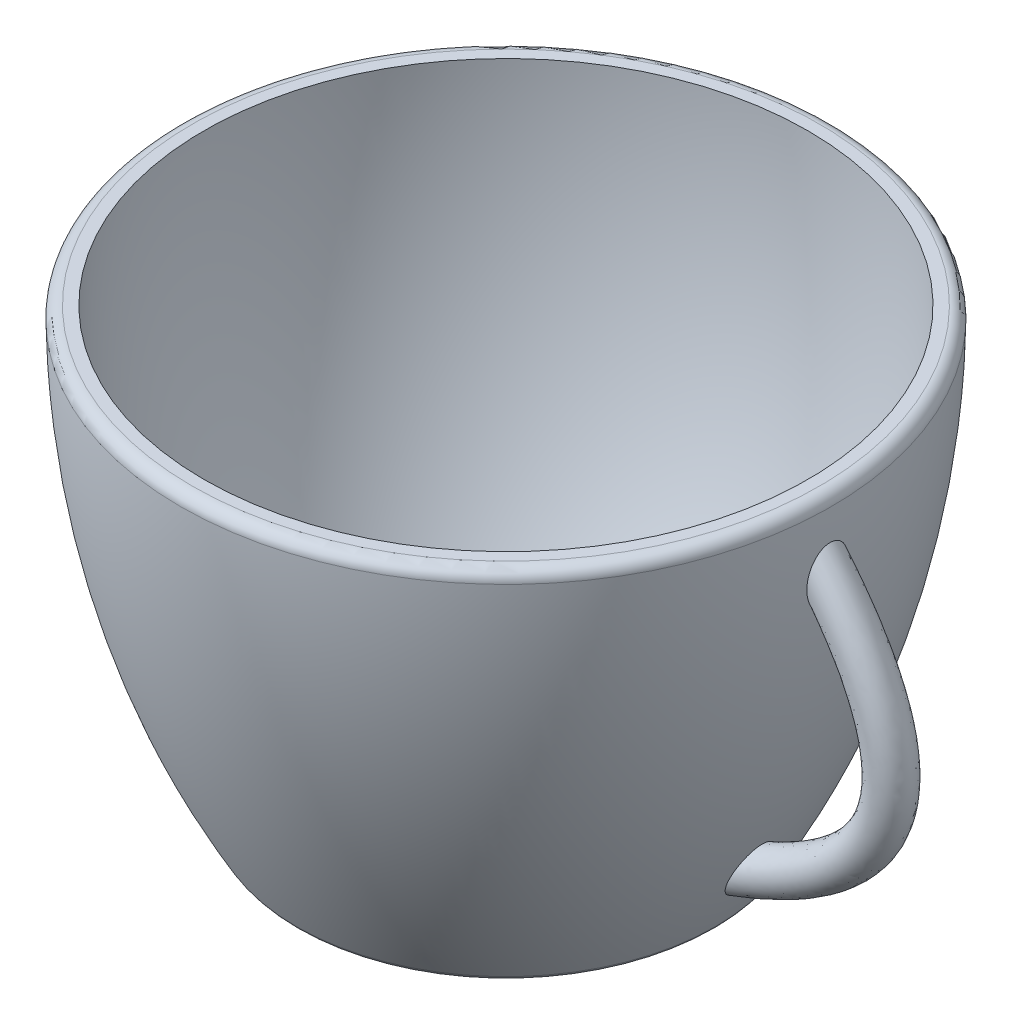
ISO-10303-21;
HEADER;
FILE_DESCRIPTION(('STEP AP214'),'2;1');
FILE_NAME('part.step','',(''),(''),'','','');
FILE_SCHEMA(('AUTOMOTIVE_DESIGN { 1 0 10303 214 1 1 1 1 }'));
ENDSEC;
DATA;
#1=APPLICATION_CONTEXT('core data for automotive mechanical design processes');
#2=APPLICATION_PROTOCOL_DEFINITION('international standard','automotive_design',2000,#1);
#3=PRODUCT_CONTEXT('',#1,'mechanical');
#4=PRODUCT('Part','Part','',(#3));
#5=PRODUCT_RELATED_PRODUCT_CATEGORY('part','',(#4));
#6=PRODUCT_DEFINITION_FORMATION('','',#4);
#7=PRODUCT_DEFINITION_CONTEXT('part definition',#1,'design');
#8=PRODUCT_DEFINITION('design','',#6,#7);
#9=PRODUCT_DEFINITION_SHAPE('','',#8);
#10=(LENGTH_UNIT() NAMED_UNIT(*) SI_UNIT(.MILLI.,.METRE.));
#11=(NAMED_UNIT(*) PLANE_ANGLE_UNIT() SI_UNIT($,.RADIAN.));
#12=(NAMED_UNIT(*) SI_UNIT($,.STERADIAN.) SOLID_ANGLE_UNIT());
#13=UNCERTAINTY_MEASURE_WITH_UNIT(LENGTH_MEASURE(1.E-05),#10,'distance_accuracy_value','');
#14=(GEOMETRIC_REPRESENTATION_CONTEXT(3) GLOBAL_UNCERTAINTY_ASSIGNED_CONTEXT((#13)) GLOBAL_UNIT_ASSIGNED_CONTEXT((#10,
#11,#12)) REPRESENTATION_CONTEXT('',''));
#15=CARTESIAN_POINT('',(0.,0.,0.));
#16=DIRECTION('',(0.,0.,1.));
#17=DIRECTION('',(1.,0.,0.));
#18=AXIS2_PLACEMENT_3D('',#15,#16,#17);
#19=CARTESIAN_POINT('',(0.,0.501778490370832,0.));
#20=DIRECTION('',(0.,1.,0.));
#21=DIRECTION('',(0.,0.,1.));
#22=AXIS2_PLACEMENT_3D('',#19,#20,#21);
#23=DEGENERATE_TOROIDAL_SURFACE('',#22,94.4481208674649,150.,.F.);
#24=CARTESIAN_POINT('',(0.,-2.03380781743742,0.));
#25=DIRECTION('',(0.,1.,0.));
#26=DIRECTION('',(0.,0.,1.));
#27=AXIS2_PLACEMENT_3D('',#24,#25,#26);
#28=CIRCLE('',#27,55.530446941658);
#29=CARTESIAN_POINT('',(0.,-2.03380781743742,55.530446941658));
#30=VERTEX_POINT('',#29);
#31=EDGE_CURVE('E124',#30,#30,#28,.T.);
#32=ORIENTED_EDGE('',*,*,#31,.F.);
#33=EDGE_LOOP('',(#32));
#34=FACE_BOUND('',#33,.T.);
#35=CARTESIAN_POINT('',(0.,-73.9932672768969,0.));
#36=DIRECTION('',(0.,1.,0.));
#37=DIRECTION('',(0.,0.,1.));
#38=AXIS2_PLACEMENT_3D('',#35,#36,#37);
#39=CIRCLE('',#38,35.7459195342858);
#40=CARTESIAN_POINT('',(0.,-73.9932672768969,35.7459195342858));
#41=VERTEX_POINT('',#40);
#42=EDGE_CURVE('E126',#41,#41,#39,.T.);
#43=ORIENTED_EDGE('',*,*,#42,.T.);
#44=EDGE_LOOP('',(#43));
#45=FACE_BOUND('',#44,.T.);
#46=CARTESIAN_POINT('',(39.4514477317299,-67.1066938259709,0.));
#47=CARTESIAN_POINT('',(39.4514481537441,-67.1066928113045,-0.0786178216172619));
#48=CARTESIAN_POINT('',(39.4529130910929,-67.1033249357118,-0.15725803469899));
#49=CARTESIAN_POINT('',(39.4587471509744,-67.0899164084059,-0.313894952554508));
#50=CARTESIAN_POINT('',(39.4631181306519,-67.0798714896406,-0.39189121351134));
#51=CARTESIAN_POINT('',(39.4746942455138,-67.053281590201,-0.546711551257011));
#52=CARTESIAN_POINT('',(39.4819049478323,-67.0367238415275,-0.623533015721282));
#53=CARTESIAN_POINT('',(39.4990343509767,-66.997416467929,-0.77529642640106));
#54=CARTESIAN_POINT('',(39.5089543213092,-66.9746639402749,-0.850237473472398));
#55=CARTESIAN_POINT('',(39.5312558970957,-66.9235556238427,-0.997182810101568));
#56=CARTESIAN_POINT('',(39.5436192342482,-66.8952414269831,-1.06920438095343));
#57=CARTESIAN_POINT('',(39.5706701933205,-66.8333502227595,-1.21051022351043));
#58=CARTESIAN_POINT('',(39.5853587087114,-66.799771192382,-1.27979343013203));
#59=CARTESIAN_POINT('',(39.6326037280989,-66.6918840442593,-1.48297960714629));
#60=CARTESIAN_POINT('',(39.6683628525912,-66.6103727142796,-1.6123679601098));
#61=CARTESIAN_POINT('',(39.761686173634,-66.3982278747713,-1.90383313246151));
#62=CARTESIAN_POINT('',(39.8223868711033,-66.2606642608401,-2.05982353871014));
#63=CARTESIAN_POINT('',(39.9535942016515,-65.9645670981585,-2.34558442305814));
#64=CARTESIAN_POINT('',(40.0241208085232,-65.805990868587,-2.47530013856102));
#65=CARTESIAN_POINT('',(40.2005440818432,-65.4110315253395,-2.75406592441258));
#66=CARTESIAN_POINT('',(40.3096862415167,-65.1680061771882,-2.89168396668417));
#67=CARTESIAN_POINT('',(40.4796969095669,-64.7916532661794,-3.0649390525482));
#68=CARTESIAN_POINT('',(40.5374825850041,-64.6640888446222,-3.11720057014552));
#69=CARTESIAN_POINT('',(40.6547762781379,-64.4058687917085,-3.21121590606389));
#70=CARTESIAN_POINT('',(40.7142843019539,-64.2752131493694,-3.25296968704643));
#71=CARTESIAN_POINT('',(40.8542414872067,-63.9687365284568,-3.33838217480844));
#72=CARTESIAN_POINT('',(40.9351916044887,-63.7920807508933,-3.37822222244129));
#73=CARTESIAN_POINT('',(41.0986683008889,-63.4364970173379,-3.44109549715187));
#74=CARTESIAN_POINT('',(41.1811953749829,-63.2575683540415,-3.46412335524426));
#75=CARTESIAN_POINT('',(41.3472686009252,-62.8985840191837,-3.49404080897922));
#76=CARTESIAN_POINT('',(41.430815881249,-62.7185272322167,-3.50091052239635));
#77=CARTESIAN_POINT('',(41.5982378375689,-62.358690930277,-3.4988967687806));
#78=CARTESIAN_POINT('',(41.6821124744136,-62.1789113855302,-3.49001513125802));
#79=CARTESIAN_POINT('',(41.8508041421239,-61.8182106257547,-3.45647903144154));
#80=CARTESIAN_POINT('',(41.9356181381376,-61.6373080787023,-3.43160784208838));
#81=CARTESIAN_POINT('',(42.1044376120732,-61.2780055743852,-3.36583325751489));
#82=CARTESIAN_POINT('',(42.1884429265144,-61.0996061199366,-3.32492668757775));
#83=CARTESIAN_POINT('',(42.354834255794,-60.7469050499732,-3.22681141112682));
#84=CARTESIAN_POINT('',(42.4372226564906,-60.5725973084154,-3.16962901488884));
#85=CARTESIAN_POINT('',(42.599653386228,-60.229485956226,-3.03833300230979));
#86=CARTESIAN_POINT('',(42.6796969729432,-60.0606793892867,-2.96422865710789));
#87=CARTESIAN_POINT('',(42.8551233703825,-59.691196859728,-2.77829948607247));
#88=CARTESIAN_POINT('',(42.9496509884152,-59.4924380871675,-2.66169789567087));
#89=CARTESIAN_POINT('',(43.0854606602614,-59.2072175962732,-2.46437349649186));
#90=CARTESIAN_POINT('',(43.1297229241366,-59.1143193862644,-2.39488254922807));
#91=CARTESIAN_POINT('',(43.2157874429229,-58.9337787873047,-2.24802018047388));
#92=CARTESIAN_POINT('',(43.2575903868163,-58.8461349262073,-2.17065098283476));
#93=CARTESIAN_POINT('',(43.3571778209537,-58.6374289070204,-1.96915049969582));
#94=CARTESIAN_POINT('',(43.4132014968977,-58.5201002213731,-1.84017414784353));
#95=CARTESIAN_POINT('',(43.5160275544374,-58.3048473945063,-1.56367340699025));
#96=CARTESIAN_POINT('',(43.5628442248535,-58.206893183673,-1.41617835047572));
#97=CARTESIAN_POINT('',(43.6346199297885,-58.0567572561893,-1.13916833382702));
#98=CARTESIAN_POINT('',(43.6621292061364,-57.9992305508932,-1.01326556017318));
#99=CARTESIAN_POINT('',(43.6964454693095,-57.927478381252,-0.817936616281332));
#100=CARTESIAN_POINT('',(43.7067271818374,-57.9059820918476,-0.751738655427597));
#101=CARTESIAN_POINT('',(43.7247789576872,-57.86824262235,-0.617539753657609));
#102=CARTESIAN_POINT('',(43.7325501253358,-57.8519971325583,-0.549539619754677));
#103=CARTESIAN_POINT('',(43.7454569583909,-57.8250164854233,-0.411684857026515));
#104=CARTESIAN_POINT('',(43.7505730010893,-57.8143223552847,-0.341820323711007));
#105=CARTESIAN_POINT('',(43.7579587790911,-57.7988839846786,-0.201292092410547));
#106=CARTESIAN_POINT('',(43.7602288420168,-57.794139059353,-0.130628487357975));
#107=CARTESIAN_POINT('',(43.7618634827723,-57.7907222881178,0.01085519347544));
#108=CARTESIAN_POINT('',(43.7612292230577,-57.79204801243,0.0816751953159842));
#109=CARTESIAN_POINT('',(43.7570779247615,-57.8007252406229,0.222875973393978));
#110=CARTESIAN_POINT('',(43.7535595438737,-57.8080795502829,0.293256529736513));
#111=CARTESIAN_POINT('',(43.739818041678,-57.8368037987803,0.488241864272037));
#112=CARTESIAN_POINT('',(43.7264934106692,-57.8646574860078,0.611730051552667));
#113=CARTESIAN_POINT('',(43.6917819935474,-57.9372281118141,0.852478305578406));
#114=CARTESIAN_POINT('',(43.6703857563386,-57.9819648188532,0.969730886664274));
#115=CARTESIAN_POINT('',(43.6284316190294,-58.0697034145489,1.16140761233445));
#116=CARTESIAN_POINT('',(43.6096263637984,-58.1090352274298,1.23794468430689));
#117=CARTESIAN_POINT('',(43.5692007835844,-58.1936010448301,1.38679911681386));
#118=CARTESIAN_POINT('',(43.5475830702695,-58.2388295736998,1.45912030312811));
#119=CARTESIAN_POINT('',(43.5018663962434,-58.3344975142649,1.59962200548418));
#120=CARTESIAN_POINT('',(43.4777621377765,-58.384948052619,1.66779316727005));
#121=CARTESIAN_POINT('',(43.4274572644701,-58.4902624557024,1.79983300130944));
#122=CARTESIAN_POINT('',(43.4012559176554,-58.545127861449,1.86370015682331));
#123=CARTESIAN_POINT('',(43.3346255993893,-58.6846907366227,2.01552909044683));
#124=CARTESIAN_POINT('',(43.2931866805792,-58.7715211753654,2.10109327569306));
#125=CARTESIAN_POINT('',(43.2072942034008,-58.9515905266741,2.26350639519966));
#126=CARTESIAN_POINT('',(43.1628395459471,-59.0448317758278,2.3403521244565));
#127=CARTESIAN_POINT('',(43.0714740583956,-59.2365818053923,2.48582928849959));
#128=CARTESIAN_POINT('',(43.0245599980409,-59.3350975172526,2.55444951036643));
#129=CARTESIAN_POINT('',(42.9288069947256,-59.5363128727925,2.68377791469527));
#130=CARTESIAN_POINT('',(42.8799674602789,-59.6390138024597,2.74448364084817));
#131=CARTESIAN_POINT('',(42.7582191281695,-59.8952366321423,2.8842079815477));
#132=CARTESIAN_POINT('',(42.6844534732572,-60.0506546219351,2.95902100458402));
#133=CARTESIAN_POINT('',(42.534605511616,-60.3668191268415,3.0935964222087));
#134=CARTESIAN_POINT('',(42.4585222162438,-60.5275679185994,3.15335229012075));
#135=CARTESIAN_POINT('',(42.3047055742962,-60.8530903274174,3.25847603172397));
#136=CARTESIAN_POINT('',(42.226970925478,-61.0178671376326,3.30383206366785));
#137=CARTESIAN_POINT('',(42.0705113861079,-61.350151778997,3.38047905625872));
#138=CARTESIAN_POINT('',(41.9917866332686,-61.5176592312829,3.41177195117271));
#139=CARTESIAN_POINT('',(41.8317999736742,-61.8588066557721,3.46110139936702));
#140=CARTESIAN_POINT('',(41.75052512222,-62.0324931635058,3.47877402560654));
#141=CARTESIAN_POINT('',(41.587962250056,-62.3807551833236,3.49945445917345));
#142=CARTESIAN_POINT('',(41.5066742288597,-62.5553307869022,3.50246072539897));
#143=CARTESIAN_POINT('',(41.3446551794005,-62.9042388124385,3.49353616364404));
#144=CARTESIAN_POINT('',(41.2639238407396,-63.0785713178349,3.48161447487643));
#145=CARTESIAN_POINT('',(41.1035261361895,-63.425969363565,3.44238027408647));
#146=CARTESIAN_POINT('',(41.0238595391346,-63.5990351750943,3.41507116027609));
#147=CARTESIAN_POINT('',(40.8812056307577,-63.9099255242706,3.35111671435178));
#148=CARTESIAN_POINT('',(40.8179308621927,-64.0481855587221,3.31723929076628));
#149=CARTESIAN_POINT('',(40.6928710676094,-64.3221901813306,3.23852065231051));
#150=CARTESIAN_POINT('',(40.6310860687577,-64.4579347236058,3.19367923767226));
#151=CARTESIAN_POINT('',(40.4487167768462,-64.8597496242657,3.0419814755227));
#152=CARTESIAN_POINT('',(40.330845688949,-65.1209951308349,2.91783553622981));
#153=CARTESIAN_POINT('',(40.1387108949235,-65.5492636851967,2.66069522906249));
#154=CARTESIAN_POINT('',(40.0614511841911,-65.7222502324441,2.53981646701241));
#155=CARTESIAN_POINT('',(39.9159558695499,-66.0493149330524,2.27008102230644));
#156=CARTESIAN_POINT('',(39.8477072446422,-66.2034203458714,2.12126547885735));
#157=CARTESIAN_POINT('',(39.7374373018442,-66.4532831220257,1.83147807343626));
#158=CARTESIAN_POINT('',(39.6929561795401,-66.5544010654732,1.69608613071251));
#159=CARTESIAN_POINT('',(39.6135438079933,-66.7353395592932,1.40909667905127));
#160=CARTESIAN_POINT('',(39.5786058034322,-66.8151751738907,1.25751073970418));
#161=CARTESIAN_POINT('',(39.5247113029292,-66.9385232404106,0.964193549692067));
#162=CARTESIAN_POINT('',(39.5041586667467,-66.9856541568817,0.824300466478014));
#163=CARTESIAN_POINT('',(39.4805942991764,-67.039733438657,0.609751094972677));
#164=CARTESIAN_POINT('',(39.4739524564976,-67.0549853163436,0.537503577916684));
#165=CARTESIAN_POINT('',(39.4631724136617,-67.079746951462,0.391859408714819));
#166=CARTESIAN_POINT('',(39.4590328591239,-67.0892598151694,0.318463400308083));
#167=CARTESIAN_POINT('',(39.4546046765374,-67.0994371100901,0.204104135432153));
#168=CARTESIAN_POINT('',(39.4534216438386,-67.1021564030092,0.16334535175212));
#169=CARTESIAN_POINT('',(39.4518430066213,-67.105785151378,0.0817264043766934));
#170=CARTESIAN_POINT('',(39.4514475123632,-67.1066943534033,0.0408662272872849));
#171=CARTESIAN_POINT('',(39.4514477317299,-67.1066938259709,0.));
#172=B_SPLINE_CURVE_WITH_KNOTS('',3,(#46,#47,#48,#49,#50,#51,#52,#53,#54,#55,#56,#57,#58,#59,
#60,#61,#62,#63,#64,#65,#66,#67,#68,#69,#70,#71,#72,#73,#74,#75,#76,#77,#78,#79,#80,#81,#82,#83,
#84,#85,#86,#87,#88,#89,#90,#91,#92,#93,#94,#95,#96,#97,#98,#99,#100,#101,#102,#103,#104,#105,
#106,#107,#108,#109,#110,#111,#112,#113,#114,#115,#116,#117,#118,#119,#120,#121,#122,#123,#124,
#125,#126,#127,#128,#129,#130,#131,#132,#133,#134,#135,#136,#137,#138,#139,#140,#141,#142,#143,
#144,#145,#146,#147,#148,#149,#150,#151,#152,#153,#154,#155,#156,#157,#158,#159,#160,#161,#162,
#163,#164,#165,#166,#167,#168,#169,#170,#171),.UNSPECIFIED.,.T.,.F.,(4,2,2,2,2,2,2,2,2,2,2,2,2,
2,2,2,2,2,2,2,2,2,2,2,2,2,2,2,2,2,2,2,2,2,2,2,2,2,2,2,2,2,2,2,2,2,2,2,2,2,2,2,2,2,2,2,2,2,2,2,2,
2,4),(0.,0.235807355915736,0.471765552680391,0.708188655043581,0.94472273098773,
1.17955101197017,1.41446974791662,1.88383352618216,2.5302929915158,3.17808627104275,
4.07243405480524,4.52057783440168,4.96872320642321,5.56300361485743,6.15747372426984,
6.75267493367963,7.3478070153406,7.95118079989776,8.55467410198872,9.15719732949192,
9.75939123730687,10.5041616501397,10.8763545169839,11.2484426119511,11.7960147935507,
12.3427303449314,12.7643049568952,12.9751480338124,13.1858982393911,13.3981845766869,
13.6104464738466,13.8226234205802,14.0348991732282,14.4149815682404,14.7955103925254,
15.0594200100005,15.3230862854211,15.5873264003473,15.8516591522205,16.23733156962,
16.623145308318,17.0094791428919,17.3959325944009,17.9579117071563,18.5201339980218,
19.0828174435971,19.6454234730616,20.2225857277801,20.7998086278582,21.3766783124689,
21.9534206490959,22.420343114991,22.8872740890208,23.8191636450037,24.4912558858733,
25.162366070772,25.6846398066956,26.2065428751822,26.6515582405845,26.8737450791733,
27.0958115496614,27.2183691060701,27.340943820106),.UNSPECIFIED.);
#173=CARTESIAN_POINT('',(39.4514477317299,-67.1066938259709,0.));
#174=VERTEX_POINT('',#173);
#175=EDGE_CURVE('E58',#174,#174,#172,.T.);
#176=ORIENTED_EDGE('',*,*,#175,.F.);
#177=EDGE_LOOP('',(#176));
#178=FACE_BOUND('',#177,.T.);
#179=CARTESIAN_POINT('',(55.3424022141649,-7.42281581670592,0.));
#180=CARTESIAN_POINT('',(55.3424020965867,-7.422816932149,0.0784158332268717));
#181=CARTESIAN_POINT('',(55.3420414240828,-7.42647703062736,0.156857041550362));
#182=CARTESIAN_POINT('',(55.3406062634407,-7.44104793588728,0.313093263603318));
#183=CARTESIAN_POINT('',(55.3395312956268,-7.45196361506066,0.390887807504496));
#184=CARTESIAN_POINT('',(55.3366882612698,-7.48085617066883,0.545307201684197));
#185=CARTESIAN_POINT('',(55.3349187614833,-7.49884764894977,0.621929290562158));
#186=CARTESIAN_POINT('',(55.3307232919552,-7.54155228388289,0.77328865225379));
#187=CARTESIAN_POINT('',(55.3282970108074,-7.56626862909137,0.848025012544993));
#188=CARTESIAN_POINT('',(55.3228560335814,-7.62177189363911,0.994541303761946));
#189=CARTESIAN_POINT('',(55.319845866459,-7.65251210610559,1.06633914328403));
#190=CARTESIAN_POINT('',(55.3132777258224,-7.7196951645561,1.20720228593452));
#191=CARTESIAN_POINT('',(55.309719540727,-7.75614021317954,1.27626652065911));
#192=CARTESIAN_POINT('',(55.2983100427108,-7.87321801012109,1.47881002067323));
#193=CARTESIAN_POINT('',(55.2897180057091,-7.96165218428136,1.60779113046386));
#194=CARTESIAN_POINT('',(55.2673746260747,-8.19270092476753,1.89955052260902));
#195=CARTESIAN_POINT('',(55.2529129062148,-8.34304383627171,2.05611518822445));
#196=CARTESIAN_POINT('',(55.2220000423565,-8.66684465387294,2.34295427121121));
#197=CARTESIAN_POINT('',(55.2055447653231,-8.84035066017865,2.47317252281958));
#198=CARTESIAN_POINT('',(55.1648475032821,-9.27296700640351,2.75318661240052));
#199=CARTESIAN_POINT('',(55.1400300137988,-9.53948111474965,2.89149592113748));
#200=CARTESIAN_POINT('',(55.1020003779068,-9.95266989652709,3.06560271765036));
#201=CARTESIAN_POINT('',(55.0891758926968,-10.0927916315663,3.11811674766764));
#202=CARTESIAN_POINT('',(55.0633494816122,-10.3765869626526,3.21255539170357));
#203=CARTESIAN_POINT('',(55.0503475554826,-10.5202605638039,3.25447999050416));
#204=CARTESIAN_POINT('',(55.0201910262596,-10.8553939011301,3.3396451828543));
#205=CARTESIAN_POINT('',(55.0030059666106,-11.0477822312084,3.37921827558555));
#206=CARTESIAN_POINT('',(54.9686441270308,-11.4352725327611,3.44167554090056));
#207=CARTESIAN_POINT('',(54.9514673512117,-11.630375312303,3.46455463059999));
#208=CARTESIAN_POINT('',(54.9172254946347,-12.0220337609467,3.49422294453335));
#209=CARTESIAN_POINT('',(54.9001605721514,-12.2185908893835,3.50099288016176));
#210=CARTESIAN_POINT('',(54.8662634747202,-12.6116052279025,3.49877274965059));
#211=CARTESIAN_POINT('',(54.8494312738104,-12.8080624467365,3.48978445601028));
#212=CARTESIAN_POINT('',(54.8158810697242,-13.2020476010437,3.45600829724918));
#213=CARTESIAN_POINT('',(54.7991669315865,-13.3995595956961,3.43103001096322));
#214=CARTESIAN_POINT('',(54.7661476685519,-13.7919645937087,3.36500333545447));
#215=CARTESIAN_POINT('',(54.7498426253941,-13.986857070121,3.3239517614942));
#216=CARTESIAN_POINT('',(54.7177674453842,-14.3722020767047,3.22549356521124));
#217=CARTESIAN_POINT('',(54.7019964804989,-14.5626613218886,3.16811369209624));
#218=CARTESIAN_POINT('',(54.6710909417777,-14.9375632324447,3.03634955077974));
#219=CARTESIAN_POINT('',(54.6559560186031,-15.122009187728,2.96197476525885));
#220=CARTESIAN_POINT('',(54.6229673727729,-15.5255748328013,2.77542144178637));
#221=CARTESIAN_POINT('',(54.6053202668721,-15.7425418843371,2.65846048338462));
#222=CARTESIAN_POINT('',(54.5716871401067,-16.1575853045812,2.39454300211275));
#223=CARTESIAN_POINT('',(54.5556987170718,-16.3556889568376,2.24763079735351));
#224=CARTESIAN_POINT('',(54.5299605120589,-16.6754476897219,1.96364309318769));
#225=CARTESIAN_POINT('',(54.5196700359774,-16.8035807420307,1.83395845462663));
#226=CARTESIAN_POINT('',(54.5008509058181,-17.0382523155204,1.55615168850898));
#227=CARTESIAN_POINT('',(54.4923195822174,-17.144823552176,1.40805805238269));
#228=CARTESIAN_POINT('',(54.4792369589071,-17.3084017857421,1.12917118675094));
#229=CARTESIAN_POINT('',(54.4742226138201,-17.3711590592909,1.00182046714698));
#230=CARTESIAN_POINT('',(54.4680046571211,-17.4490159310693,0.80441990670999));
#231=CARTESIAN_POINT('',(54.4661490956942,-17.4722571731005,0.737547447060659));
#232=CARTESIAN_POINT('',(54.4629066352738,-17.5128770910041,0.602045874819124));
#233=CARTESIAN_POINT('',(54.4615195337706,-17.5302583000943,0.533417535111047));
#234=CARTESIAN_POINT('',(54.4592356206038,-17.5588803674857,0.39438868515426));
#235=CARTESIAN_POINT('',(54.4583422369456,-17.5700782932841,0.323979248513029));
#236=CARTESIAN_POINT('',(54.4570813278366,-17.58588363078,0.182424339328822));
#237=CARTESIAN_POINT('',(54.4567137424056,-17.5904917942014,0.111278951671851));
#238=CARTESIAN_POINT('',(54.4565136044925,-17.5930007186834,-0.0311096161544141));
#239=CARTESIAN_POINT('',(54.4566808615444,-17.5909038675067,-0.102352752481568));
#240=CARTESIAN_POINT('',(54.4575452173475,-17.5800687713658,-0.244344940120463));
#241=CARTESIAN_POINT('',(54.4582425636784,-17.5713274230687,-0.315093744966381));
#242=CARTESIAN_POINT('',(54.4609197572869,-17.5377731490395,-0.511833657388157));
#243=CARTESIAN_POINT('',(54.4634795986563,-17.5056937350867,-0.636635849705881));
#244=CARTESIAN_POINT('',(54.4700999150502,-17.422774492121,-0.879820949535818));
#245=CARTESIAN_POINT('',(54.4741621485419,-17.371912679451,-0.998196147666378));
#246=CARTESIAN_POINT('',(54.482113351926,-17.2724355609548,-1.19165829542506));
#247=CARTESIAN_POINT('',(54.4856747755785,-17.2278977383439,-1.26890482781316));
#248=CARTESIAN_POINT('',(54.4933279821435,-17.1322497960758,-1.41908144144879));
#249=CARTESIAN_POINT('',(54.4974192737618,-17.0811457649573,-1.49201543116531));
#250=CARTESIAN_POINT('',(54.506073074946,-16.97313215408,-1.63364494520963));
#251=CARTESIAN_POINT('',(54.5106365860263,-16.9162102386324,-1.70233094633554));
#252=CARTESIAN_POINT('',(54.5201660686088,-16.7974492170952,-1.83529917691186));
#253=CARTESIAN_POINT('',(54.5251321806893,-16.7356083935859,-1.89957985354678));
#254=CARTESIAN_POINT('',(54.5377125611702,-16.5791052110678,-2.05157560132374));
#255=CARTESIAN_POINT('',(54.5455175165241,-16.4821375714363,-2.13690746187839));
#256=CARTESIAN_POINT('',(54.5617212556534,-16.2811690528255,-2.29876277918652));
#257=CARTESIAN_POINT('',(54.5701202480928,-16.1771657030177,-2.37528311571366));
#258=CARTESIAN_POINT('',(54.5874189691576,-15.9633814620962,-2.51999610611002));
#259=CARTESIAN_POINT('',(54.5963193388811,-15.8535931860898,-2.58817772746358));
#260=CARTESIAN_POINT('',(54.6145322550128,-15.6294360284903,-2.71650355502224));
#261=CARTESIAN_POINT('',(54.6238449254387,-15.515065769659,-2.77664532071511));
#262=CARTESIAN_POINT('',(54.6469418698921,-15.2321207349295,-2.91370453707423));
#263=CARTESIAN_POINT('',(54.6609110631896,-15.0615842283958,-2.98655830301439));
#264=CARTESIAN_POINT('',(54.6894279076691,-14.7148968118793,-3.11729738199579));
#265=CARTESIAN_POINT('',(54.7039757953317,-14.5387436126203,-3.17517650169456));
#266=CARTESIAN_POINT('',(54.7335546184976,-14.1822616380992,-3.27658673195014));
#267=CARTESIAN_POINT('',(54.7485859204969,-14.0019297251797,-3.32010666070141));
#268=CARTESIAN_POINT('',(54.7790348170844,-13.6385182077089,-3.39310526115701));
#269=CARTESIAN_POINT('',(54.7944523609469,-13.4554389652211,-3.42258576660587));
#270=CARTESIAN_POINT('',(54.825973256461,-13.0832392211065,-3.46821330986802));
#271=CARTESIAN_POINT('',(54.8420841994403,-12.8940785162048,-3.4840270018487));
#272=CARTESIAN_POINT('',(54.8745627088968,-12.515102401529,-3.50107557391495));
#273=CARTESIAN_POINT('',(54.8909303009191,-12.3252869280692,-3.50230899343467));
#274=CARTESIAN_POINT('',(54.9238296437237,-11.946252613444,-3.48995109279821));
#275=CARTESIAN_POINT('',(54.940361296737,-11.7570334962058,-3.47636813153046));
#276=CARTESIAN_POINT('',(54.9734989241474,-11.3803358463271,-3.43396040353176));
#277=CARTESIAN_POINT('',(54.9901048819317,-11.1928569508676,-3.40513888997653));
#278=CARTESIAN_POINT('',(55.0202044589346,-10.8554210860861,-3.33843288517808));
#279=CARTESIAN_POINT('',(55.0337054275641,-10.7049400163153,-3.30321207471878));
#280=CARTESIAN_POINT('',(55.0605911391142,-10.4069984747427,-3.22182730942457));
#281=CARTESIAN_POINT('',(55.073975879694,-10.2595380636952,-3.17566313472079));
#282=CARTESIAN_POINT('',(55.1137872989657,-9.82349069341866,-3.02007299962132));
#283=CARTESIAN_POINT('',(55.1399289105167,-9.54059072433484,-2.89342749791593));
#284=CARTESIAN_POINT('',(55.1831128169721,-9.07832232077283,-2.63259648696392));
#285=CARTESIAN_POINT('',(55.200651777674,-8.89216067119344,-2.51047440012423));
#286=CARTESIAN_POINT('',(55.233989262854,-8.54084675337896,-2.23868380827505));
#287=CARTESIAN_POINT('',(55.2497903139428,-8.37566393009242,-2.08905616068672));
#288=CARTESIAN_POINT('',(55.275484279886,-8.10867751990277,-1.79846150952724));
#289=CARTESIAN_POINT('',(55.285908977357,-8.00095439021377,-1.66300204162322));
#290=CARTESIAN_POINT('',(55.3045834885481,-7.80871143982585,-1.37624839559847));
#291=CARTESIAN_POINT('',(55.3128348254464,-7.72417536698114,-1.224965411676));
#292=CARTESIAN_POINT('',(55.3255567055484,-7.59416884752142,-0.932472826666037));
#293=CARTESIAN_POINT('',(55.3304043307844,-7.544786600278,-0.793041601257168));
#294=CARTESIAN_POINT('',(55.3359152207347,-7.48871473560648,-0.579404359078008));
#295=CARTESIAN_POINT('',(55.3374582592338,-7.47302940998857,-0.507499276363597));
#296=CARTESIAN_POINT('',(55.3399345530054,-7.44786813174804,-0.362613186167492));
#297=CARTESIAN_POINT('',(55.3408681528026,-7.43838867084887,-0.289632810469455));
#298=CARTESIAN_POINT('',(55.3417921572718,-7.42900803243197,-0.180418802412684));
#299=CARTESIAN_POINT('',(55.3420207721414,-7.4266874384902,-0.144378945368497));
#300=CARTESIAN_POINT('',(55.3423258371455,-7.42359097750791,-0.0722278587301229));
#301=CARTESIAN_POINT('',(55.3424022683188,-7.42281530295719,-0.0361166208032155));
#302=CARTESIAN_POINT('',(55.3424022141649,-7.42281581670592,0.));
#303=B_SPLINE_CURVE_WITH_KNOTS('',3,(#179,#180,#181,#182,#183,#184,#185,#186,#187,#188,#189,
#190,#191,#192,#193,#194,#195,#196,#197,#198,#199,#200,#201,#202,#203,#204,#205,#206,#207,#208,
#209,#210,#211,#212,#213,#214,#215,#216,#217,#218,#219,#220,#221,#222,#223,#224,#225,#226,#227,
#228,#229,#230,#231,#232,#233,#234,#235,#236,#237,#238,#239,#240,#241,#242,#243,#244,#245,#246,
#247,#248,#249,#250,#251,#252,#253,#254,#255,#256,#257,#258,#259,#260,#261,#262,#263,#264,#265,
#266,#267,#268,#269,#270,#271,#272,#273,#274,#275,#276,#277,#278,#279,#280,#281,#282,#283,#284,
#285,#286,#287,#288,#289,#290,#291,#292,#293,#294,#295,#296,#297,#298,#299,#300,#301,#302),
.UNSPECIFIED.,.T.,.F.,(4,2,2,2,2,2,2,2,2,2,2,2,2,2,2,2,2,2,2,2,2,2,2,2,2,2,2,2,2,2,2,2,2,2,2,2,
2,2,2,2,2,2,2,2,2,2,2,2,2,2,2,2,2,2,2,2,2,2,2,2,2,4),(0.,0.235206135903825,0.470570381251849,
0.706422902092787,0.942387446493192,1.17659005063958,1.4108833045631,1.87898878901381,
2.52807907314626,3.17853884860949,4.07717447400709,4.5274491183584,4.97772440979594,
5.56843090324953,6.1593171763114,6.75091060318385,7.34243749138485,7.94114320244295,
8.53996760024581,9.13781658945152,9.73533280687971,10.474575463889,11.2127321191117,
11.7587780698709,12.3039891938526,12.728337428171,12.9405712865244,13.1527132808866,
13.3663102947481,13.5798829406946,13.7933795384885,14.0069759118416,14.3918300877199,
14.7771361471566,15.0445063032366,15.3116303048465,15.5793329270723,15.8471294305068,
16.2347451912706,16.6224977903052,17.0107579785404,17.3991357575048,17.9562477114569,
18.5135897135307,19.0713647108589,19.6290668349968,20.2000161684812,20.7710226958232,
21.3417072476101,21.9122700169654,22.377260927331,22.8422611808648,23.7702979026387,
24.4382099120987,25.1051376904517,25.6233632461603,26.1412246363883,26.5831097771252,
26.8037209390993,27.0242072780435,27.132524594209,27.2408554053661),.UNSPECIFIED.);
#304=CARTESIAN_POINT('',(55.3424022141649,-7.42281581670592,0.));
#305=VERTEX_POINT('',#304);
#306=EDGE_CURVE('E11',#305,#305,#303,.T.);
#307=ORIENTED_EDGE('',*,*,#306,.F.);
#308=EDGE_LOOP('',(#307));
#309=FACE_BOUND('',#308,.T.);
#310=ADVANCED_FACE('F49',(#34,#45,#178,#309),#23,.F.);
#311=CARTESIAN_POINT('',(0.,0.,0.));
#312=DIRECTION('',(0.,-1.,0.));
#313=DIRECTION('',(0.,0.,-1.));
#314=AXIS2_PLACEMENT_3D('',#311,#312,#313);
#315=PLANE('',#314);
#316=CARTESIAN_POINT('',(0.,0.,0.));
#317=DIRECTION('',(0.,-1.,0.));
#318=DIRECTION('',(0.,0.,-1.));
#319=AXIS2_PLACEMENT_3D('',#316,#317,#318);
#320=CIRCLE('',#319,51.5510168640526);
#321=CARTESIAN_POINT('',(0.,0.,-51.5510168640526));
#322=VERTEX_POINT('',#321);
#323=EDGE_CURVE('E136',#322,#322,#320,.F.);
#324=ORIENTED_EDGE('',*,*,#323,.F.);
#325=EDGE_LOOP('',(#324));
#326=FACE_BOUND('',#325,.T.);
#327=CARTESIAN_POINT('',(0.,0.,0.));
#328=DIRECTION('',(0.,1.,0.));
#329=DIRECTION('',(0.,0.,1.));
#330=AXIS2_PLACEMENT_3D('',#327,#328,#329);
#331=CIRCLE('',#330,53.530732704203);
#332=CARTESIAN_POINT('',(0.,0.,53.530732704203));
#333=VERTEX_POINT('',#332);
#334=EDGE_CURVE('E53',#333,#333,#331,.T.);
#335=ORIENTED_EDGE('',*,*,#334,.T.);
#336=EDGE_LOOP('',(#335));
#337=FACE_BOUND('',#336,.T.);
#338=ADVANCED_FACE('F51',(#326,#337),#315,.F.);
#339=CARTESIAN_POINT('',(0.,-2.,0.));
#340=DIRECTION('',(0.,1.,0.));
#341=DIRECTION('',(0.,0.,1.));
#342=AXIS2_PLACEMENT_3D('',#339,#340,#341);
#343=TOROIDAL_SURFACE('',#342,53.530732704203,2.00000000000001);
#344=ORIENTED_EDGE('',*,*,#334,.F.);
#345=EDGE_LOOP('',(#344));
#346=FACE_BOUND('',#345,.T.);
#347=ORIENTED_EDGE('',*,*,#31,.T.);
#348=EDGE_LOOP('',(#347));
#349=FACE_BOUND('',#348,.T.);
#350=ADVANCED_FACE('F106',(#346,#349),#343,.T.);
#351=CARTESIAN_POINT('',(0.,-73.,0.));
#352=DIRECTION('',(0.,1.,0.));
#353=DIRECTION('',(0.,0.,1.));
#354=AXIS2_PLACEMENT_3D('',#351,#352,#353);
#355=TOROIDAL_SURFACE('',#354,34.0099989955958,2.);
#356=ORIENTED_EDGE('',*,*,#42,.F.);
#357=EDGE_LOOP('',(#356));
#358=FACE_BOUND('',#357,.T.);
#359=CARTESIAN_POINT('',(0.,-75.,0.));
#360=DIRECTION('',(0.,1.,0.));
#361=DIRECTION('',(0.,0.,1.));
#362=AXIS2_PLACEMENT_3D('',#359,#360,#361);
#363=CIRCLE('',#362,34.0099989955958);
#364=CARTESIAN_POINT('',(0.,-75.,34.0099989955958));
#365=VERTEX_POINT('',#364);
#366=EDGE_CURVE('E130',#365,#365,#363,.T.);
#367=ORIENTED_EDGE('',*,*,#366,.T.);
#368=EDGE_LOOP('',(#367));
#369=FACE_BOUND('',#368,.T.);
#370=ADVANCED_FACE('F111',(#358,#369),#355,.T.);
#371=CARTESIAN_POINT('',(0.,-75.,0.));
#372=DIRECTION('',(0.,1.,0.));
#373=DIRECTION('',(0.,0.,1.));
#374=AXIS2_PLACEMENT_3D('',#371,#372,#373);
#375=PLANE('',#374);
#376=ORIENTED_EDGE('',*,*,#366,.F.);
#377=EDGE_LOOP('',(#376));
#378=FACE_BOUND('',#377,.T.);
#379=ADVANCED_FACE('F118',(#378),#375,.F.);
#380=CARTESIAN_POINT('',(0.,0.501778490370832,0.));
#381=DIRECTION('',(0.,1.,0.));
#382=DIRECTION('',(0.,0.,1.));
#383=AXIS2_PLACEMENT_3D('',#380,#381,#382);
#384=DEGENERATE_TOROIDAL_SURFACE('',#383,94.4481208674649,146.,.F.);
#385=ORIENTED_EDGE('',*,*,#323,.T.);
#386=EDGE_LOOP('',(#385));
#387=FACE_BOUND('',#386,.T.);
#388=CARTESIAN_POINT('',(0.,-71.,0.));
#389=DIRECTION('',(0.,1.,0.));
#390=DIRECTION('',(0.,0.,1.));
#391=AXIS2_PLACEMENT_3D('',#388,#389,#390);
#392=CIRCLE('',#391,32.844831304735);
#393=CARTESIAN_POINT('',(0.,-71.,32.844831304735));
#394=VERTEX_POINT('',#393);
#395=EDGE_CURVE('E139',#394,#394,#392,.T.);
#396=ORIENTED_EDGE('',*,*,#395,.F.);
#397=EDGE_LOOP('',(#396));
#398=FACE_BOUND('',#397,.T.);
#399=ADVANCED_FACE('F97',(#387,#398),#384,.T.);
#400=CARTESIAN_POINT('',(0.,-71.,0.));
#401=DIRECTION('',(0.,1.,0.));
#402=DIRECTION('',(0.,0.,1.));
#403=AXIS2_PLACEMENT_3D('',#400,#401,#402);
#404=PLANE('',#403);
#405=ORIENTED_EDGE('',*,*,#395,.T.);
#406=EDGE_LOOP('',(#405));
#407=FACE_BOUND('',#406,.T.);
#408=ADVANCED_FACE('F86',(#407),#404,.T.);
#409=CARTESIAN_POINT('',(54.2847323350133,-6.18531357740146,0.));
#410=CARTESIAN_POINT('',(54.8790129410559,-6.87478812703738,0.));
#411=CARTESIAN_POINT('',(55.4662042389278,-7.56480307493061,0.));
#412=CARTESIAN_POINT('',(56.3293460929635,-8.59954968586606,0.));
#413=CARTESIAN_POINT('',(56.6141204177265,-8.94442356229811,0.));
#414=CARTESIAN_POINT('',(57.0360060831434,-9.46158129589681,0.));
#415=CARTESIAN_POINT('',(57.1757553990528,-9.63394204292251,0.));
#416=CARTESIAN_POINT('',(57.3839527316971,-9.89243750625504,0.));
#417=CARTESIAN_POINT('',(57.4531140724127,-9.97859507633319,0.));
#418=CARTESIAN_POINT('',(57.5909432849145,-10.1508940441157,0.));
#419=CARTESIAN_POINT('',(57.6476210198069,-10.2219392104777,0.));
#420=CARTESIAN_POINT('',(57.7911829695597,-10.4026884005584,0.));
#421=CARTESIAN_POINT('',(57.8728479103645,-10.5058594848228,0.));
#422=CARTESIAN_POINT('',(58.0166724493448,-10.688350734268,0.));
#423=CARTESIAN_POINT('',(58.0882513590361,-10.7795298488977,0.));
#424=CARTESIAN_POINT('',(58.3019878493575,-11.0528687067212,0.));
#425=CARTESIAN_POINT('',(58.4431451962057,-11.2348299589846,0.));
#426=CARTESIAN_POINT('',(58.8626148494524,-11.7799282846319,0.));
#427=CARTESIAN_POINT('',(59.1369248579681,-12.1422798495453,0.));
#428=CARTESIAN_POINT('',(59.9438310112301,-13.2262635949008,0.));
#429=CARTESIAN_POINT('',(60.4604050810675,-13.9448236398716,0.));
#430=CARTESIAN_POINT('',(61.9458632174538,-16.088828227641,0.));
#431=CARTESIAN_POINT('',(62.8505265820187,-17.5025841042082,0.));
#432=CARTESIAN_POINT('',(65.3049349713983,-21.7026004526863,0.));
#433=CARTESIAN_POINT('',(66.5963400817452,-24.4481190730755,0.));
#434=CARTESIAN_POINT('',(68.4526925242987,-29.8574221208309,0.));
#435=CARTESIAN_POINT('',(69.0169559953886,-32.5236521573137,0.));
#436=CARTESIAN_POINT('',(69.3471158604151,-37.7578172265527,0.));
#437=CARTESIAN_POINT('',(69.1087425985517,-40.3249778948412,0.));
#438=CARTESIAN_POINT('',(67.7990773088473,-45.2456984744089,0.));
#439=CARTESIAN_POINT('',(66.7294467420711,-47.593356185691,0.));
#440=CARTESIAN_POINT('',(63.8404789072929,-51.979320477282,0.));
#441=CARTESIAN_POINT('',(62.0251354780673,-54.0191938764844,0.));
#442=CARTESIAN_POINT('',(55.5726047712177,-59.7056723705295,0.));
#443=CARTESIAN_POINT('',(49.938633544773,-62.9352488851486,0.));
#444=CARTESIAN_POINT('',(41.3452112378294,-66.4106624189151,0.));
#445=CARTESIAN_POINT('',(39.6391477302518,-67.0466442269165,0.));
#446=CARTESIAN_POINT('',(37.9086343078221,-67.667010011038,0.));
#447=CARTESIAN_POINT('',(54.2847323350133,-6.18531357740146,7.));
#448=CARTESIAN_POINT('',(54.8790129410559,-6.87478812703738,7.));
#449=CARTESIAN_POINT('',(55.4662042389278,-7.56480307493061,7.));
#450=CARTESIAN_POINT('',(56.3293460929635,-8.59954968586606,7.));
#451=CARTESIAN_POINT('',(56.6141204177265,-8.94442356229811,7.));
#452=CARTESIAN_POINT('',(57.0360060831434,-9.46158129589681,7.));
#453=CARTESIAN_POINT('',(57.1757553990528,-9.63394204292251,7.));
#454=CARTESIAN_POINT('',(57.3839527316971,-9.89243750625504,7.));
#455=CARTESIAN_POINT('',(57.4531140724127,-9.97859507633319,7.));
#456=CARTESIAN_POINT('',(57.5909432849145,-10.1508940441157,7.));
#457=CARTESIAN_POINT('',(57.647621019807,-10.2219392104777,7.));
#458=CARTESIAN_POINT('',(57.7911829695598,-10.4026884005584,7.));
#459=CARTESIAN_POINT('',(57.8728479103645,-10.5058594848228,7.));
#460=CARTESIAN_POINT('',(58.0166724493448,-10.688350734268,7.));
#461=CARTESIAN_POINT('',(58.0882513590361,-10.7795298488977,7.));
#462=CARTESIAN_POINT('',(58.3019878493576,-11.0528687067212,7.));
#463=CARTESIAN_POINT('',(58.4431451962057,-11.2348299589846,7.));
#464=CARTESIAN_POINT('',(58.8626148494524,-11.7799282846319,7.));
#465=CARTESIAN_POINT('',(59.1369248579681,-12.1422798495453,7.));
#466=CARTESIAN_POINT('',(59.9438310112301,-13.2262635949008,7.));
#467=CARTESIAN_POINT('',(60.4604050810675,-13.9448236398716,7.));
#468=CARTESIAN_POINT('',(61.9458632174538,-16.088828227641,7.));
#469=CARTESIAN_POINT('',(62.8505265820187,-17.5025841042082,7.));
#470=CARTESIAN_POINT('',(65.3049349713983,-21.7026004526863,7.));
#471=CARTESIAN_POINT('',(66.5963400817452,-24.4481190730755,7.));
#472=CARTESIAN_POINT('',(68.4526925242987,-29.8574221208309,7.));
#473=CARTESIAN_POINT('',(69.0169559953886,-32.5236521573137,7.));
#474=CARTESIAN_POINT('',(69.3471158604151,-37.7578172265527,7.));
#475=CARTESIAN_POINT('',(69.1087425985517,-40.3249778948412,7.));
#476=CARTESIAN_POINT('',(67.7990773088473,-45.2456984744089,7.));
#477=CARTESIAN_POINT('',(66.7294467420711,-47.593356185691,7.));
#478=CARTESIAN_POINT('',(63.8404789072929,-51.979320477282,7.));
#479=CARTESIAN_POINT('',(62.0251354780673,-54.0191938764844,7.));
#480=CARTESIAN_POINT('',(55.5726047712177,-59.7056723705295,7.));
#481=CARTESIAN_POINT('',(49.938633544773,-62.9352488851486,7.));
#482=CARTESIAN_POINT('',(41.3452112378294,-66.4106624189151,7.));
#483=CARTESIAN_POINT('',(39.6391477302518,-67.0466442269165,7.));
#484=CARTESIAN_POINT('',(37.9086343078221,-67.667010011038,7.));
#485=CARTESIAN_POINT('',(48.9825051003354,-10.7554761950596,7.));
#486=CARTESIAN_POINT('',(49.5575960131613,-11.4226871793856,7.));
#487=CARTESIAN_POINT('',(50.1205390950761,-12.0843179293268,7.));
#488=CARTESIAN_POINT('',(50.9391251612466,-13.0656504342017,7.));
#489=CARTESIAN_POINT('',(51.2076812023657,-13.3909046913988,7.));
#490=CARTESIAN_POINT('',(51.6030954294803,-13.8756130905654,7.));
#491=CARTESIAN_POINT('',(51.7336634689158,-14.036653376651,7.));
#492=CARTESIAN_POINT('',(51.9275398495895,-14.2773681072917,7.));
#493=CARTESIAN_POINT('',(51.99183602697,-14.3574653759892,7.));
#494=CARTESIAN_POINT('',(52.1197496763442,-14.5173689940311,7.));
#495=CARTESIAN_POINT('',(52.1722785332397,-14.5832141777174,7.));
#496=CARTESIAN_POINT('',(52.3050456755545,-14.7503723521713,7.));
#497=CARTESIAN_POINT('',(52.3805303904592,-14.8457358446357,7.));
#498=CARTESIAN_POINT('',(52.5133823918358,-15.0143046291687,7.));
#499=CARTESIAN_POINT('',(52.5794606750506,-15.0984770997046,7.));
#500=CARTESIAN_POINT('',(52.7766525316065,-15.3506577019026,7.));
#501=CARTESIAN_POINT('',(52.9067231069009,-15.5183290290109,7.));
#502=CARTESIAN_POINT('',(53.2927642927581,-16.0199872596033,7.));
#503=CARTESIAN_POINT('',(53.5445642738714,-16.3526184896236,7.));
#504=CARTESIAN_POINT('',(54.2832963801833,-17.3450184014919,7.));
#505=CARTESIAN_POINT('',(54.7535588709756,-17.9992944911729,7.));
#506=CARTESIAN_POINT('',(56.0978435792734,-19.9395393968452,7.));
#507=CARTESIAN_POINT('',(56.9053196614711,-21.2029379686215,7.));
#508=CARTESIAN_POINT('',(59.0642622634141,-24.897349323261,7.));
#509=CARTESIAN_POINT('',(60.1510013486533,-27.2320683156522,7.));
#510=CARTESIAN_POINT('',(61.6560910332336,-31.6178121151349,7.));
#511=CARTESIAN_POINT('',(62.0751254937159,-33.6663913129708,7.));
#512=CARTESIAN_POINT('',(62.3167152279441,-37.4964163340297,7.));
#513=CARTESIAN_POINT('',(62.1435401574507,-39.2786365216079,7.));
#514=CARTESIAN_POINT('',(61.2352625182773,-42.6912492754,7.));
#515=CARTESIAN_POINT('',(60.4984984887223,-44.3275440414787,7.));
#516=CARTESIAN_POINT('',(58.3798308668342,-47.5440563264153,7.));
#517=CARTESIAN_POINT('',(56.9939334356848,-49.1227070261204,7.));
#518=CARTESIAN_POINT('',(51.7504721655443,-53.7436582613012,7.));
#519=CARTESIAN_POINT('',(46.7974228773067,-56.6548448086751,7.));
#520=CARTESIAN_POINT('',(38.8432174219013,-59.8717416747714,7.));
#521=CARTESIAN_POINT('',(37.2216093149717,-60.4770960537271,7.));
#522=CARTESIAN_POINT('',(35.5464286924383,-61.0776257734442,7.));
#523=CARTESIAN_POINT('',(48.9825051003353,-10.7554761950596,0.));
#524=CARTESIAN_POINT('',(49.5575960131613,-11.4226871793856,0.));
#525=CARTESIAN_POINT('',(50.1205390950761,-12.0843179293268,0.));
#526=CARTESIAN_POINT('',(50.9391251612466,-13.0656504342017,0.));
#527=CARTESIAN_POINT('',(51.2076812023657,-13.3909046913988,0.));
#528=CARTESIAN_POINT('',(51.6030954294803,-13.8756130905654,0.));
#529=CARTESIAN_POINT('',(51.7336634689158,-14.036653376651,0.));
#530=CARTESIAN_POINT('',(51.9275398495895,-14.2773681072917,0.));
#531=CARTESIAN_POINT('',(51.99183602697,-14.3574653759892,0.));
#532=CARTESIAN_POINT('',(52.1197496763442,-14.5173689940311,0.));
#533=CARTESIAN_POINT('',(52.1722785332397,-14.5832141777174,0.));
#534=CARTESIAN_POINT('',(52.3050456755545,-14.7503723521713,0.));
#535=CARTESIAN_POINT('',(52.3805303904592,-14.8457358446357,0.));
#536=CARTESIAN_POINT('',(52.5133823918358,-15.0143046291687,0.));
#537=CARTESIAN_POINT('',(52.5794606750506,-15.0984770997046,0.));
#538=CARTESIAN_POINT('',(52.7766525316065,-15.3506577019026,0.));
#539=CARTESIAN_POINT('',(52.9067231069009,-15.5183290290109,0.));
#540=CARTESIAN_POINT('',(53.2927642927581,-16.0199872596033,0.));
#541=CARTESIAN_POINT('',(53.5445642738713,-16.3526184896236,0.));
#542=CARTESIAN_POINT('',(54.2832963801833,-17.3450184014919,0.));
#543=CARTESIAN_POINT('',(54.7535588709756,-17.9992944911729,0.));
#544=CARTESIAN_POINT('',(56.0978435792734,-19.9395393968452,0.));
#545=CARTESIAN_POINT('',(56.9053196614711,-21.2029379686215,0.));
#546=CARTESIAN_POINT('',(59.0642622634141,-24.897349323261,0.));
#547=CARTESIAN_POINT('',(60.1510013486533,-27.2320683156522,0.));
#548=CARTESIAN_POINT('',(61.6560910332336,-31.6178121151349,0.));
#549=CARTESIAN_POINT('',(62.0751254937159,-33.6663913129708,0.));
#550=CARTESIAN_POINT('',(62.3167152279441,-37.4964163340297,0.));
#551=CARTESIAN_POINT('',(62.1435401574507,-39.2786365216079,0.));
#552=CARTESIAN_POINT('',(61.2352625182773,-42.6912492754,0.));
#553=CARTESIAN_POINT('',(60.4984984887223,-44.3275440414787,0.));
#554=CARTESIAN_POINT('',(58.3798308668342,-47.5440563264152,0.));
#555=CARTESIAN_POINT('',(56.9939334356848,-49.1227070261204,0.));
#556=CARTESIAN_POINT('',(51.7504721655443,-53.7436582613011,0.));
#557=CARTESIAN_POINT('',(46.7974228773067,-56.6548448086751,0.));
#558=CARTESIAN_POINT('',(38.8432174219013,-59.8717416747714,0.));
#559=CARTESIAN_POINT('',(37.2216093149717,-60.4770960537271,0.));
#560=CARTESIAN_POINT('',(35.5464286924383,-61.0776257734442,0.));
#561=CARTESIAN_POINT('',(48.9825051003354,-10.7554761950596,-7.));
#562=CARTESIAN_POINT('',(49.5575960131613,-11.4226871793856,-7.));
#563=CARTESIAN_POINT('',(50.1205390950761,-12.0843179293268,-7.));
#564=CARTESIAN_POINT('',(50.9391251612466,-13.0656504342017,-7.));
#565=CARTESIAN_POINT('',(51.2076812023657,-13.3909046913988,-7.));
#566=CARTESIAN_POINT('',(51.6030954294803,-13.8756130905654,-7.));
#567=CARTESIAN_POINT('',(51.7336634689158,-14.036653376651,-7.));
#568=CARTESIAN_POINT('',(51.9275398495895,-14.2773681072917,-7.));
#569=CARTESIAN_POINT('',(51.99183602697,-14.3574653759892,-7.));
#570=CARTESIAN_POINT('',(52.1197496763442,-14.5173689940311,-7.));
#571=CARTESIAN_POINT('',(52.1722785332397,-14.5832141777174,-7.));
#572=CARTESIAN_POINT('',(52.3050456755545,-14.7503723521713,-7.));
#573=CARTESIAN_POINT('',(52.3805303904592,-14.8457358446357,-7.));
#574=CARTESIAN_POINT('',(52.5133823918358,-15.0143046291687,-7.));
#575=CARTESIAN_POINT('',(52.5794606750506,-15.0984770997046,-7.));
#576=CARTESIAN_POINT('',(52.7766525316065,-15.3506577019026,-7.));
#577=CARTESIAN_POINT('',(52.9067231069009,-15.5183290290109,-7.));
#578=CARTESIAN_POINT('',(53.2927642927581,-16.0199872596033,-7.));
#579=CARTESIAN_POINT('',(53.5445642738714,-16.3526184896236,-7.));
#580=CARTESIAN_POINT('',(54.2832963801833,-17.3450184014919,-7.));
#581=CARTESIAN_POINT('',(54.7535588709756,-17.9992944911729,-7.));
#582=CARTESIAN_POINT('',(56.0978435792734,-19.9395393968452,-7.));
#583=CARTESIAN_POINT('',(56.9053196614711,-21.2029379686215,-7.));
#584=CARTESIAN_POINT('',(59.0642622634141,-24.897349323261,-7.));
#585=CARTESIAN_POINT('',(60.1510013486533,-27.2320683156522,-7.));
#586=CARTESIAN_POINT('',(61.6560910332336,-31.6178121151349,-7.));
#587=CARTESIAN_POINT('',(62.0751254937159,-33.6663913129708,-7.));
#588=CARTESIAN_POINT('',(62.3167152279441,-37.4964163340297,-7.));
#589=CARTESIAN_POINT('',(62.1435401574507,-39.2786365216079,-7.));
#590=CARTESIAN_POINT('',(61.2352625182773,-42.6912492754,-7.));
#591=CARTESIAN_POINT('',(60.4984984887223,-44.3275440414787,-7.));
#592=CARTESIAN_POINT('',(58.3798308668342,-47.5440563264153,-7.));
#593=CARTESIAN_POINT('',(56.9939334356848,-49.1227070261204,-7.));
#594=CARTESIAN_POINT('',(51.7504721655443,-53.7436582613012,-7.));
#595=CARTESIAN_POINT('',(46.7974228773067,-56.6548448086751,-7.));
#596=CARTESIAN_POINT('',(38.8432174219013,-59.8717416747714,-7.));
#597=CARTESIAN_POINT('',(37.2216093149717,-60.4770960537271,-7.));
#598=CARTESIAN_POINT('',(35.5464286924383,-61.0776257734442,-7.));
#599=CARTESIAN_POINT('',(54.2847323350133,-6.18531357740146,-7.));
#600=CARTESIAN_POINT('',(54.8790129410559,-6.87478812703738,-7.));
#601=CARTESIAN_POINT('',(55.4662042389278,-7.56480307493061,-7.));
#602=CARTESIAN_POINT('',(56.3293460929635,-8.59954968586606,-7.));
#603=CARTESIAN_POINT('',(56.6141204177265,-8.94442356229811,-7.));
#604=CARTESIAN_POINT('',(57.0360060831434,-9.46158129589681,-7.));
#605=CARTESIAN_POINT('',(57.1757553990528,-9.63394204292251,-7.));
#606=CARTESIAN_POINT('',(57.3839527316971,-9.89243750625504,-7.));
#607=CARTESIAN_POINT('',(57.4531140724127,-9.97859507633319,-7.));
#608=CARTESIAN_POINT('',(57.5909432849145,-10.1508940441157,-7.));
#609=CARTESIAN_POINT('',(57.647621019807,-10.2219392104777,-7.));
#610=CARTESIAN_POINT('',(57.7911829695598,-10.4026884005584,-7.));
#611=CARTESIAN_POINT('',(57.8728479103645,-10.5058594848228,-7.));
#612=CARTESIAN_POINT('',(58.0166724493448,-10.688350734268,-7.));
#613=CARTESIAN_POINT('',(58.0882513590361,-10.7795298488977,-7.));
#614=CARTESIAN_POINT('',(58.3019878493576,-11.0528687067212,-7.));
#615=CARTESIAN_POINT('',(58.4431451962057,-11.2348299589846,-7.));
#616=CARTESIAN_POINT('',(58.8626148494524,-11.7799282846319,-7.));
#617=CARTESIAN_POINT('',(59.1369248579681,-12.1422798495453,-7.));
#618=CARTESIAN_POINT('',(59.9438310112301,-13.2262635949008,-7.));
#619=CARTESIAN_POINT('',(60.4604050810675,-13.9448236398716,-7.));
#620=CARTESIAN_POINT('',(61.9458632174538,-16.088828227641,-7.));
#621=CARTESIAN_POINT('',(62.8505265820187,-17.5025841042082,-7.));
#622=CARTESIAN_POINT('',(65.3049349713983,-21.7026004526863,-7.));
#623=CARTESIAN_POINT('',(66.5963400817452,-24.4481190730755,-7.));
#624=CARTESIAN_POINT('',(68.4526925242987,-29.8574221208309,-7.));
#625=CARTESIAN_POINT('',(69.0169559953886,-32.5236521573137,-7.));
#626=CARTESIAN_POINT('',(69.3471158604151,-37.7578172265527,-7.));
#627=CARTESIAN_POINT('',(69.1087425985517,-40.3249778948412,-7.));
#628=CARTESIAN_POINT('',(67.7990773088473,-45.2456984744089,-7.));
#629=CARTESIAN_POINT('',(66.7294467420711,-47.593356185691,-7.));
#630=CARTESIAN_POINT('',(63.8404789072929,-51.979320477282,-7.));
#631=CARTESIAN_POINT('',(62.0251354780673,-54.0191938764844,-7.));
#632=CARTESIAN_POINT('',(55.5726047712177,-59.7056723705295,-7.));
#633=CARTESIAN_POINT('',(49.938633544773,-62.9352488851486,-7.));
#634=CARTESIAN_POINT('',(41.3452112378294,-66.4106624189151,-7.));
#635=CARTESIAN_POINT('',(39.6391477302518,-67.0466442269165,-7.));
#636=CARTESIAN_POINT('',(37.9086343078221,-67.667010011038,-7.));
#637=CARTESIAN_POINT('',(54.2847323350133,-6.18531357740146,0.));
#638=CARTESIAN_POINT('',(54.8790129410559,-6.87478812703738,0.));
#639=CARTESIAN_POINT('',(55.4662042389278,-7.56480307493061,0.));
#640=CARTESIAN_POINT('',(56.3293460929635,-8.59954968586606,0.));
#641=CARTESIAN_POINT('',(56.6141204177265,-8.94442356229811,0.));
#642=CARTESIAN_POINT('',(57.0360060831434,-9.46158129589681,0.));
#643=CARTESIAN_POINT('',(57.1757553990528,-9.63394204292251,0.));
#644=CARTESIAN_POINT('',(57.3839527316971,-9.89243750625504,0.));
#645=CARTESIAN_POINT('',(57.4531140724127,-9.97859507633319,0.));
#646=CARTESIAN_POINT('',(57.5909432849145,-10.1508940441157,0.));
#647=CARTESIAN_POINT('',(57.6476210198069,-10.2219392104777,0.));
#648=CARTESIAN_POINT('',(57.7911829695597,-10.4026884005584,0.));
#649=CARTESIAN_POINT('',(57.8728479103645,-10.5058594848228,0.));
#650=CARTESIAN_POINT('',(58.0166724493448,-10.688350734268,0.));
#651=CARTESIAN_POINT('',(58.0882513590361,-10.7795298488977,0.));
#652=CARTESIAN_POINT('',(58.3019878493575,-11.0528687067212,0.));
#653=CARTESIAN_POINT('',(58.4431451962057,-11.2348299589846,0.));
#654=CARTESIAN_POINT('',(58.8626148494524,-11.7799282846319,0.));
#655=CARTESIAN_POINT('',(59.1369248579681,-12.1422798495453,0.));
#656=CARTESIAN_POINT('',(59.9438310112301,-13.2262635949008,0.));
#657=CARTESIAN_POINT('',(60.4604050810675,-13.9448236398716,0.));
#658=CARTESIAN_POINT('',(61.9458632174538,-16.088828227641,0.));
#659=CARTESIAN_POINT('',(62.8505265820187,-17.5025841042082,0.));
#660=CARTESIAN_POINT('',(65.3049349713983,-21.7026004526863,0.));
#661=CARTESIAN_POINT('',(66.5963400817452,-24.4481190730755,0.));
#662=CARTESIAN_POINT('',(68.4526925242987,-29.8574221208309,0.));
#663=CARTESIAN_POINT('',(69.0169559953886,-32.5236521573137,0.));
#664=CARTESIAN_POINT('',(69.3471158604151,-37.7578172265527,0.));
#665=CARTESIAN_POINT('',(69.1087425985517,-40.3249778948412,0.));
#666=CARTESIAN_POINT('',(67.7990773088473,-45.2456984744089,0.));
#667=CARTESIAN_POINT('',(66.7294467420711,-47.593356185691,0.));
#668=CARTESIAN_POINT('',(63.8404789072929,-51.979320477282,0.));
#669=CARTESIAN_POINT('',(62.0251354780673,-54.0191938764844,0.));
#670=CARTESIAN_POINT('',(55.5726047712177,-59.7056723705295,0.));
#671=CARTESIAN_POINT('',(49.938633544773,-62.9352488851486,0.));
#672=CARTESIAN_POINT('',(41.3452112378294,-66.4106624189151,0.));
#673=CARTESIAN_POINT('',(39.6391477302518,-67.0466442269165,0.));
#674=CARTESIAN_POINT('',(37.9086343078221,-67.667010011038,0.));
#675=(BOUNDED_SURFACE() B_SPLINE_SURFACE(3,3,((#409,#410,#411,#412,#413,#414,#415,#416,#417,
#418,#419,#420,#421,#422,#423,#424,#425,#426,#427,#428,#429,#430,#431,#432,#433,#434,#435,#436,
#437,#438,#439,#440,#441,#442,#443,#444,#445,#446),(#447,#448,#449,#450,#451,#452,#453,#454,
#455,#456,#457,#458,#459,#460,#461,#462,#463,#464,#465,#466,#467,#468,#469,#470,#471,#472,#473,
#474,#475,#476,#477,#478,#479,#480,#481,#482,#483,#484),(#485,#486,#487,#488,#489,#490,#491,
#492,#493,#494,#495,#496,#497,#498,#499,#500,#501,#502,#503,#504,#505,#506,#507,#508,#509,#510,
#511,#512,#513,#514,#515,#516,#517,#518,#519,#520,#521,#522),(#523,#524,#525,#526,#527,#528,
#529,#530,#531,#532,#533,#534,#535,#536,#537,#538,#539,#540,#541,#542,#543,#544,#545,#546,#547,
#548,#549,#550,#551,#552,#553,#554,#555,#556,#557,#558,#559,#560),(#561,#562,#563,#564,#565,
#566,#567,#568,#569,#570,#571,#572,#573,#574,#575,#576,#577,#578,#579,#580,#581,#582,#583,#584,
#585,#586,#587,#588,#589,#590,#591,#592,#593,#594,#595,#596,#597,#598),(#599,#600,#601,#602,
#603,#604,#605,#606,#607,#608,#609,#610,#611,#612,#613,#614,#615,#616,#617,#618,#619,#620,#621,
#622,#623,#624,#625,#626,#627,#628,#629,#630,#631,#632,#633,#634,#635,#636),(#637,#638,#639,
#640,#641,#642,#643,#644,#645,#646,#647,#648,#649,#650,#651,#652,#653,#654,#655,#656,#657,#658,
#659,#660,#661,#662,#663,#664,#665,#666,#667,#668,#669,#670,#671,#672,#673,#674)),.UNSPECIFIED.,
.T.,.F.,.F.) B_SPLINE_SURFACE_WITH_KNOTS((4,3,4),(4,2,2,2,2,2,2,2,2,2,2,2,2,2,2,2,2,2,4),(0.,
0.5,1.),(0.,0.0349319033829542,0.0523978550744314,0.0611308309201699,0.0654973188430392,
0.0698638067659085,0.0732938788727213,0.0767239509795342,0.0835840951931599,0.0973043836204112,
0.124744960474914,0.17962611418392,0.289388421601931,0.399150729019942,0.508913036437953,
0.618675343855964,0.728437651273975,0.947962266109997,1.),
.UNSPECIFIED.) GEOMETRIC_REPRESENTATION_ITEM() RATIONAL_B_SPLINE_SURFACE(((1.,1.,1.,1.,1.,1.,1.,
1.,1.,1.,1.,1.,1.,1.,1.,1.,1.,1.,1.,1.,1.,1.,1.,1.,1.,1.,1.,1.,1.,1.,1.,1.,1.,1.,1.,1.,1.,1.),
(0.333333333333333,0.333333333333333,0.333333333333333,0.333333333333333,0.333333333333333,
0.333333333333333,0.333333333333333,0.333333333333333,0.333333333333333,0.333333333333333,
0.333333333333333,0.333333333333333,0.333333333333333,0.333333333333333,0.333333333333333,
0.333333333333333,0.333333333333333,0.333333333333333,0.333333333333333,0.333333333333333,
0.333333333333333,0.333333333333333,0.333333333333333,0.333333333333333,0.333333333333333,
0.333333333333333,0.333333333333333,0.333333333333333,0.333333333333333,0.333333333333333,
0.333333333333333,0.333333333333333,0.333333333333333,0.333333333333333,0.333333333333333,
0.333333333333333,0.333333333333333,0.333333333333333),(0.333333333333333,0.333333333333333,
0.333333333333333,0.333333333333333,0.333333333333333,0.333333333333333,0.333333333333333,
0.333333333333333,0.333333333333333,0.333333333333333,0.333333333333333,0.333333333333333,
0.333333333333333,0.333333333333333,0.333333333333333,0.333333333333333,0.333333333333333,
0.333333333333333,0.333333333333333,0.333333333333333,0.333333333333333,0.333333333333333,
0.333333333333333,0.333333333333333,0.333333333333333,0.333333333333333,0.333333333333333,
0.333333333333333,0.333333333333333,0.333333333333333,0.333333333333333,0.333333333333333,
0.333333333333333,0.333333333333333,0.333333333333333,0.333333333333333,0.333333333333333,
0.333333333333333),(1.,1.,1.,1.,1.,1.,1.,1.,1.,1.,1.,1.,1.,1.,1.,1.,1.,1.,1.,1.,1.,1.,1.,1.,1.,
1.,1.,1.,1.,1.,1.,1.,1.,1.,1.,1.,1.,1.),(0.333333333333333,0.333333333333333,0.333333333333333,
0.333333333333333,0.333333333333333,0.333333333333333,0.333333333333333,0.333333333333333,
0.333333333333333,0.333333333333333,0.333333333333333,0.333333333333333,0.333333333333333,
0.333333333333333,0.333333333333333,0.333333333333333,0.333333333333333,0.333333333333333,
0.333333333333333,0.333333333333333,0.333333333333333,0.333333333333333,0.333333333333333,
0.333333333333333,0.333333333333333,0.333333333333333,0.333333333333333,0.333333333333333,
0.333333333333333,0.333333333333333,0.333333333333333,0.333333333333333,0.333333333333333,
0.333333333333333,0.333333333333333,0.333333333333333,0.333333333333333,0.333333333333333),
(0.333333333333333,0.333333333333333,0.333333333333333,0.333333333333333,0.333333333333333,
0.333333333333333,0.333333333333333,0.333333333333333,0.333333333333333,0.333333333333333,
0.333333333333333,0.333333333333333,0.333333333333333,0.333333333333333,0.333333333333333,
0.333333333333333,0.333333333333333,0.333333333333333,0.333333333333333,0.333333333333333,
0.333333333333333,0.333333333333333,0.333333333333333,0.333333333333333,0.333333333333333,
0.333333333333333,0.333333333333333,0.333333333333333,0.333333333333333,0.333333333333333,
0.333333333333333,0.333333333333333,0.333333333333333,0.333333333333333,0.333333333333333,
0.333333333333333,0.333333333333333,0.333333333333333),(1.,1.,1.,1.,1.,1.,1.,1.,1.,1.,1.,1.,1.,
1.,1.,1.,1.,1.,1.,1.,1.,1.,1.,1.,1.,1.,1.,1.,1.,1.,1.,1.,1.,1.,1.,1.,1.,1.))) REPRESENTATION_ITEM('') SURFACE());
#676=ORIENTED_EDGE('',*,*,#306,.T.);
#677=EDGE_LOOP('',(#676));
#678=FACE_BOUND('',#677,.T.);
#679=ORIENTED_EDGE('',*,*,#175,.T.);
#680=EDGE_LOOP('',(#679));
#681=FACE_BOUND('',#680,.T.);
#682=ADVANCED_FACE('F81',(#678,#681),#675,.T.);
#683=CLOSED_SHELL('',(#310,#338,#350,#370,#379,#399,#408,#682));
#684=MANIFOLD_SOLID_BREP('B2',#683);
#685=ADVANCED_BREP_SHAPE_REPRESENTATION('',(#18,#684),#14);
#686=SHAPE_DEFINITION_REPRESENTATION(#9,#685);
ENDSEC;
END-ISO-10303-21;
